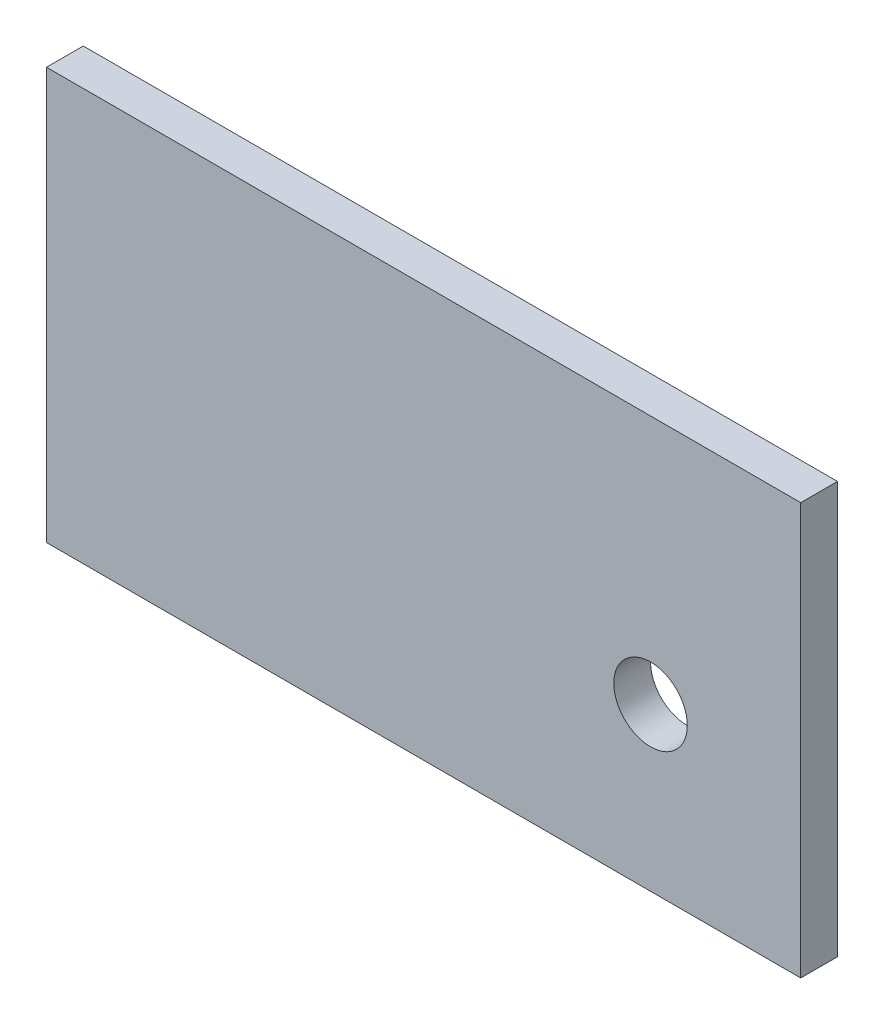
ISO-10303-21;
HEADER;
FILE_DESCRIPTION(('STEP AP214'),'2;1');
FILE_NAME('part.step','',(''),(''),'','','');
FILE_SCHEMA(('AUTOMOTIVE_DESIGN { 1 0 10303 214 1 1 1 1 }'));
ENDSEC;
DATA;
#1=APPLICATION_CONTEXT('core data for automotive mechanical design processes');
#2=APPLICATION_PROTOCOL_DEFINITION('international standard','automotive_design',2000,#1);
#3=PRODUCT_CONTEXT('',#1,'mechanical');
#4=PRODUCT('Part','Part','',(#3));
#5=PRODUCT_RELATED_PRODUCT_CATEGORY('part','',(#4));
#6=PRODUCT_DEFINITION_FORMATION('','',#4);
#7=PRODUCT_DEFINITION_CONTEXT('part definition',#1,'design');
#8=PRODUCT_DEFINITION('design','',#6,#7);
#9=PRODUCT_DEFINITION_SHAPE('','',#8);
#10=(LENGTH_UNIT() NAMED_UNIT(*) SI_UNIT(.MILLI.,.METRE.));
#11=(NAMED_UNIT(*) PLANE_ANGLE_UNIT() SI_UNIT($,.RADIAN.));
#12=(NAMED_UNIT(*) SI_UNIT($,.STERADIAN.) SOLID_ANGLE_UNIT());
#13=UNCERTAINTY_MEASURE_WITH_UNIT(LENGTH_MEASURE(1.E-05),#10,'distance_accuracy_value','');
#14=(GEOMETRIC_REPRESENTATION_CONTEXT(3) GLOBAL_UNCERTAINTY_ASSIGNED_CONTEXT((#13)) GLOBAL_UNIT_ASSIGNED_CONTEXT((#10,
#11,#12)) REPRESENTATION_CONTEXT('',''));
#15=CARTESIAN_POINT('',(0.,0.,0.));
#16=DIRECTION('',(0.,0.,1.));
#17=DIRECTION('',(1.,0.,0.));
#18=AXIS2_PLACEMENT_3D('',#15,#16,#17);
#19=CARTESIAN_POINT('',(0.,0.,3.175));
#20=DIRECTION('',(0.,0.,-1.));
#21=DIRECTION('',(-1.,0.,0.));
#22=AXIS2_PLACEMENT_3D('',#19,#20,#21);
#23=PLANE('',#22);
#24=DIRECTION('',(0.,-1.,0.));
#25=VECTOR('',#24,1.);
#26=CARTESIAN_POINT('',(0.,0.,3.175));
#27=LINE('',#26,#25);
#28=CARTESIAN_POINT('',(0.,35.56,3.175));
#29=VERTEX_POINT('',#28);
#30=CARTESIAN_POINT('',(0.,0.,3.175));
#31=VERTEX_POINT('',#30);
#32=EDGE_CURVE('E86',#29,#31,#27,.T.);
#33=ORIENTED_EDGE('',*,*,#32,.T.);
#34=DIRECTION('',(1.,0.,0.));
#35=VECTOR('',#34,1.);
#36=CARTESIAN_POINT('',(0.,0.,3.175));
#37=LINE('',#36,#35);
#38=CARTESIAN_POINT('',(65.151,0.,3.175));
#39=VERTEX_POINT('',#38);
#40=EDGE_CURVE('E81',#31,#39,#37,.T.);
#41=ORIENTED_EDGE('',*,*,#40,.T.);
#42=DIRECTION('',(0.,1.,0.));
#43=VECTOR('',#42,1.);
#44=CARTESIAN_POINT('',(65.151,0.,3.175));
#45=LINE('',#44,#43);
#46=CARTESIAN_POINT('',(65.151,35.56,3.175));
#47=VERTEX_POINT('',#46);
#48=EDGE_CURVE('E84',#39,#47,#45,.T.);
#49=ORIENTED_EDGE('',*,*,#48,.T.);
#50=DIRECTION('',(-1.,0.,0.));
#51=VECTOR('',#50,1.);
#52=CARTESIAN_POINT('',(0.,35.56,3.175));
#53=LINE('',#52,#51);
#54=EDGE_CURVE('E51',#47,#29,#53,.T.);
#55=ORIENTED_EDGE('',*,*,#54,.T.);
#56=EDGE_LOOP('',(#33,#41,#49,#55));
#57=FACE_BOUND('',#56,.T.);
#58=CARTESIAN_POINT('',(52.1758290492,13.98345124818,3.175));
#59=DIRECTION('',(0.,0.,1.));
#60=DIRECTION('',(1.,0.,0.));
#61=AXIS2_PLACEMENT_3D('',#58,#59,#60);
#62=CIRCLE('',#61,3.175);
#63=CARTESIAN_POINT('',(55.3508290492,13.98345124818,3.175));
#64=VERTEX_POINT('',#63);
#65=EDGE_CURVE('E101',#64,#64,#62,.T.);
#66=ORIENTED_EDGE('',*,*,#65,.F.);
#67=EDGE_LOOP('',(#66));
#68=FACE_BOUND('',#67,.T.);
#69=ADVANCED_FACE('F34',(#57,#68),#23,.F.);
#70=CARTESIAN_POINT('',(0.,0.,0.));
#71=DIRECTION('',(0.,0.,-1.));
#72=DIRECTION('',(-1.,0.,0.));
#73=AXIS2_PLACEMENT_3D('',#70,#71,#72);
#74=PLANE('',#73);
#75=DIRECTION('',(0.,-1.,0.));
#76=VECTOR('',#75,1.);
#77=CARTESIAN_POINT('',(0.,0.,0.));
#78=LINE('',#77,#76);
#79=CARTESIAN_POINT('',(0.,35.56,0.));
#80=VERTEX_POINT('',#79);
#81=CARTESIAN_POINT('',(0.,0.,0.));
#82=VERTEX_POINT('',#81);
#83=EDGE_CURVE('E98',#80,#82,#78,.T.);
#84=ORIENTED_EDGE('',*,*,#83,.F.);
#85=DIRECTION('',(-1.,0.,0.));
#86=VECTOR('',#85,1.);
#87=CARTESIAN_POINT('',(0.,35.56,0.));
#88=LINE('',#87,#86);
#89=CARTESIAN_POINT('',(65.151,35.56,0.));
#90=VERTEX_POINT('',#89);
#91=EDGE_CURVE('E74',#90,#80,#88,.T.);
#92=ORIENTED_EDGE('',*,*,#91,.F.);
#93=DIRECTION('',(0.,1.,0.));
#94=VECTOR('',#93,1.);
#95=CARTESIAN_POINT('',(65.151,0.,0.));
#96=LINE('',#95,#94);
#97=CARTESIAN_POINT('',(65.151,0.,0.));
#98=VERTEX_POINT('',#97);
#99=EDGE_CURVE('E68',#98,#90,#96,.T.);
#100=ORIENTED_EDGE('',*,*,#99,.F.);
#101=DIRECTION('',(1.,0.,0.));
#102=VECTOR('',#101,1.);
#103=CARTESIAN_POINT('',(0.,0.,0.));
#104=LINE('',#103,#102);
#105=EDGE_CURVE('E90',#82,#98,#104,.T.);
#106=ORIENTED_EDGE('',*,*,#105,.F.);
#107=EDGE_LOOP('',(#84,#92,#100,#106));
#108=FACE_BOUND('',#107,.T.);
#109=CARTESIAN_POINT('',(52.1758290492,13.98345124818,0.));
#110=DIRECTION('',(0.,0.,1.));
#111=DIRECTION('',(1.,0.,0.));
#112=AXIS2_PLACEMENT_3D('',#109,#110,#111);
#113=CIRCLE('',#112,3.175);
#114=CARTESIAN_POINT('',(55.3508290492,13.98345124818,0.));
#115=VERTEX_POINT('',#114);
#116=EDGE_CURVE('E113',#115,#115,#113,.T.);
#117=ORIENTED_EDGE('',*,*,#116,.T.);
#118=EDGE_LOOP('',(#117));
#119=FACE_BOUND('',#118,.T.);
#120=ADVANCED_FACE('F109',(#108,#119),#74,.T.);
#121=CARTESIAN_POINT('',(0.,0.,3.175));
#122=DIRECTION('',(1.,0.,0.));
#123=DIRECTION('',(0.,0.,-1.));
#124=AXIS2_PLACEMENT_3D('',#121,#122,#123);
#125=PLANE('',#124);
#126=ORIENTED_EDGE('',*,*,#83,.T.);
#127=DIRECTION('',(0.,0.,-1.));
#128=VECTOR('',#127,1.);
#129=CARTESIAN_POINT('',(0.,0.,3.175));
#130=LINE('',#129,#128);
#131=EDGE_CURVE('E11',#31,#82,#130,.T.);
#132=ORIENTED_EDGE('',*,*,#131,.F.);
#133=ORIENTED_EDGE('',*,*,#32,.F.);
#134=DIRECTION('',(0.,0.,-1.));
#135=VECTOR('',#134,1.);
#136=CARTESIAN_POINT('',(0.,35.56,3.175));
#137=LINE('',#136,#135);
#138=EDGE_CURVE('E94',#29,#80,#137,.T.);
#139=ORIENTED_EDGE('',*,*,#138,.T.);
#140=EDGE_LOOP('',(#126,#132,#133,#139));
#141=FACE_BOUND('',#140,.T.);
#142=ADVANCED_FACE('F36',(#141),#125,.F.);
#143=CARTESIAN_POINT('',(0.,0.,3.175));
#144=DIRECTION('',(0.,1.,0.));
#145=DIRECTION('',(0.,0.,1.));
#146=AXIS2_PLACEMENT_3D('',#143,#144,#145);
#147=PLANE('',#146);
#148=ORIENTED_EDGE('',*,*,#105,.T.);
#149=DIRECTION('',(0.,0.,-1.));
#150=VECTOR('',#149,1.);
#151=CARTESIAN_POINT('',(65.151,0.,3.175));
#152=LINE('',#151,#150);
#153=EDGE_CURVE('E43',#39,#98,#152,.T.);
#154=ORIENTED_EDGE('',*,*,#153,.F.);
#155=ORIENTED_EDGE('',*,*,#40,.F.);
#156=ORIENTED_EDGE('',*,*,#131,.T.);
#157=EDGE_LOOP('',(#148,#154,#155,#156));
#158=FACE_BOUND('',#157,.T.);
#159=ADVANCED_FACE('F89',(#158),#147,.F.);
#160=CARTESIAN_POINT('',(65.151,0.,3.175));
#161=DIRECTION('',(-1.,0.,0.));
#162=DIRECTION('',(0.,0.,1.));
#163=AXIS2_PLACEMENT_3D('',#160,#161,#162);
#164=PLANE('',#163);
#165=ORIENTED_EDGE('',*,*,#99,.T.);
#166=DIRECTION('',(0.,0.,-1.));
#167=VECTOR('',#166,1.);
#168=CARTESIAN_POINT('',(65.151,35.56,3.175));
#169=LINE('',#168,#167);
#170=EDGE_CURVE('E91',#47,#90,#169,.T.);
#171=ORIENTED_EDGE('',*,*,#170,.F.);
#172=ORIENTED_EDGE('',*,*,#48,.F.);
#173=ORIENTED_EDGE('',*,*,#153,.T.);
#174=EDGE_LOOP('',(#165,#171,#172,#173));
#175=FACE_BOUND('',#174,.T.);
#176=ADVANCED_FACE('F92',(#175),#164,.F.);
#177=CARTESIAN_POINT('',(0.,35.56,3.175));
#178=DIRECTION('',(0.,-1.,0.));
#179=DIRECTION('',(0.,0.,-1.));
#180=AXIS2_PLACEMENT_3D('',#177,#178,#179);
#181=PLANE('',#180);
#182=ORIENTED_EDGE('',*,*,#91,.T.);
#183=ORIENTED_EDGE('',*,*,#138,.F.);
#184=ORIENTED_EDGE('',*,*,#54,.F.);
#185=ORIENTED_EDGE('',*,*,#170,.T.);
#186=EDGE_LOOP('',(#182,#183,#184,#185));
#187=FACE_BOUND('',#186,.T.);
#188=ADVANCED_FACE('F106',(#187),#181,.F.);
#189=CARTESIAN_POINT('',(52.1758290492,13.98345124818,3.175));
#190=DIRECTION('',(0.,0.,-1.));
#191=DIRECTION('',(-1.,0.,0.));
#192=AXIS2_PLACEMENT_3D('',#189,#190,#191);
#193=CYLINDRICAL_SURFACE('',#192,3.175);
#194=ORIENTED_EDGE('',*,*,#65,.T.);
#195=EDGE_LOOP('',(#194));
#196=FACE_BOUND('',#195,.T.);
#197=ORIENTED_EDGE('',*,*,#116,.F.);
#198=EDGE_LOOP('',(#197));
#199=FACE_BOUND('',#198,.T.);
#200=ADVANCED_FACE('F119',(#196,#199),#193,.F.);
#201=CLOSED_SHELL('',(#69,#120,#142,#159,#176,#188,#200));
#202=MANIFOLD_SOLID_BREP('B2',#201);
#203=ADVANCED_BREP_SHAPE_REPRESENTATION('',(#18,#202),#14);
#204=SHAPE_DEFINITION_REPRESENTATION(#9,#203);
ENDSEC;
END-ISO-10303-21;
